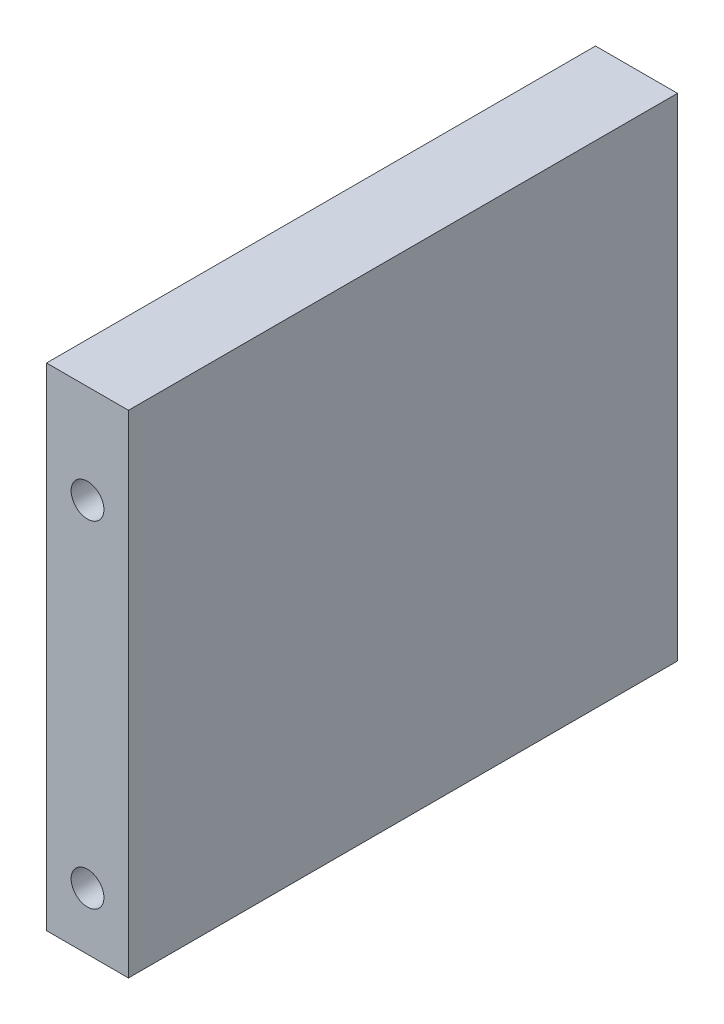
ISO-10303-21;
HEADER;
FILE_DESCRIPTION(('STEP AP214'),'2;1');
FILE_NAME('part.step','',(''),(''),'','','');
FILE_SCHEMA(('AUTOMOTIVE_DESIGN { 1 0 10303 214 1 1 1 1 }'));
ENDSEC;
DATA;
#1=APPLICATION_CONTEXT('core data for automotive mechanical design processes');
#2=APPLICATION_PROTOCOL_DEFINITION('international standard','automotive_design',2000,#1);
#3=PRODUCT_CONTEXT('',#1,'mechanical');
#4=PRODUCT('Part','Part','',(#3));
#5=PRODUCT_RELATED_PRODUCT_CATEGORY('part','',(#4));
#6=PRODUCT_DEFINITION_FORMATION('','',#4);
#7=PRODUCT_DEFINITION_CONTEXT('part definition',#1,'design');
#8=PRODUCT_DEFINITION('design','',#6,#7);
#9=PRODUCT_DEFINITION_SHAPE('','',#8);
#10=(LENGTH_UNIT() NAMED_UNIT(*) SI_UNIT(.MILLI.,.METRE.));
#11=(NAMED_UNIT(*) PLANE_ANGLE_UNIT() SI_UNIT($,.RADIAN.));
#12=(NAMED_UNIT(*) SI_UNIT($,.STERADIAN.) SOLID_ANGLE_UNIT());
#13=UNCERTAINTY_MEASURE_WITH_UNIT(LENGTH_MEASURE(1.E-05),#10,'distance_accuracy_value','');
#14=(GEOMETRIC_REPRESENTATION_CONTEXT(3) GLOBAL_UNCERTAINTY_ASSIGNED_CONTEXT((#13)) GLOBAL_UNIT_ASSIGNED_CONTEXT((#10,
#11,#12)) REPRESENTATION_CONTEXT('',''));
#15=CARTESIAN_POINT('',(0.,0.,0.));
#16=DIRECTION('',(0.,0.,1.));
#17=DIRECTION('',(1.,0.,0.));
#18=AXIS2_PLACEMENT_3D('',#15,#16,#17);
#19=CARTESIAN_POINT('',(5.,7.,10.0014));
#20=DIRECTION('',(0.,0.,1.));
#21=DIRECTION('',(1.,0.,0.));
#22=AXIS2_PLACEMENT_3D('',#19,#20,#21);
#23=PLANE('',#22);
#24=CARTESIAN_POINT('',(5.,7.,10.0014));
#25=DIRECTION('',(0.,0.,1.));
#26=DIRECTION('',(1.,0.,0.));
#27=AXIS2_PLACEMENT_3D('',#24,#25,#26);
#28=CIRCLE('',#27,2.);
#29=CARTESIAN_POINT('',(7.,7.,10.0014));
#30=VERTEX_POINT('',#29);
#31=EDGE_CURVE('E18',#30,#30,#28,.F.);
#32=ORIENTED_EDGE('',*,*,#31,.T.);
#33=EDGE_LOOP('',(#32));
#34=FACE_BOUND('',#33,.T.);
#35=ADVANCED_FACE('F15',(#34),#23,.F.);
#36=CARTESIAN_POINT('',(5.,48.,10.0014));
#37=DIRECTION('',(0.,0.,1.));
#38=DIRECTION('',(1.,0.,0.));
#39=AXIS2_PLACEMENT_3D('',#36,#37,#38);
#40=PLANE('',#39);
#41=CARTESIAN_POINT('',(5.,48.,10.0014));
#42=DIRECTION('',(0.,0.,1.));
#43=DIRECTION('',(1.,0.,0.));
#44=AXIS2_PLACEMENT_3D('',#41,#42,#43);
#45=CIRCLE('',#44,2.);
#46=CARTESIAN_POINT('',(7.,48.,10.0014));
#47=VERTEX_POINT('',#46);
#48=EDGE_CURVE('E95',#47,#47,#45,.F.);
#49=ORIENTED_EDGE('',*,*,#48,.T.);
#50=EDGE_LOOP('',(#49));
#51=FACE_BOUND('',#50,.T.);
#52=ADVANCED_FACE('F223',(#51),#40,.F.);
#53=CARTESIAN_POINT('',(5.,7.,57.0014));
#54=DIRECTION('',(0.,0.,1.));
#55=DIRECTION('',(1.,0.,0.));
#56=AXIS2_PLACEMENT_3D('',#53,#54,#55);
#57=PLANE('',#56);
#58=CARTESIAN_POINT('',(5.,7.,57.0014));
#59=DIRECTION('',(0.,0.,1.));
#60=DIRECTION('',(1.,0.,0.));
#61=AXIS2_PLACEMENT_3D('',#58,#59,#60);
#62=CIRCLE('',#61,2.);
#63=CARTESIAN_POINT('',(7.,7.,57.0014));
#64=VERTEX_POINT('',#63);
#65=EDGE_CURVE('E93',#64,#64,#62,.T.);
#66=ORIENTED_EDGE('',*,*,#65,.T.);
#67=EDGE_LOOP('',(#66));
#68=FACE_BOUND('',#67,.T.);
#69=ADVANCED_FACE('F116',(#68),#57,.T.);
#70=CARTESIAN_POINT('',(5.,48.,57.0014));
#71=DIRECTION('',(0.,0.,1.));
#72=DIRECTION('',(1.,0.,0.));
#73=AXIS2_PLACEMENT_3D('',#70,#71,#72);
#74=PLANE('',#73);
#75=CARTESIAN_POINT('',(5.,48.,57.0014));
#76=DIRECTION('',(0.,0.,1.));
#77=DIRECTION('',(1.,0.,0.));
#78=AXIS2_PLACEMENT_3D('',#75,#76,#77);
#79=CIRCLE('',#78,2.);
#80=CARTESIAN_POINT('',(7.,48.,57.0014));
#81=VERTEX_POINT('',#80);
#82=EDGE_CURVE('E64',#81,#81,#79,.T.);
#83=ORIENTED_EDGE('',*,*,#82,.T.);
#84=EDGE_LOOP('',(#83));
#85=FACE_BOUND('',#84,.T.);
#86=ADVANCED_FACE('F106',(#85),#74,.T.);
#87=CARTESIAN_POINT('',(5.,7.,0.001400000000103));
#88=DIRECTION('',(0.,0.,1.));
#89=DIRECTION('',(1.,0.,0.));
#90=AXIS2_PLACEMENT_3D('',#87,#88,#89);
#91=CYLINDRICAL_SURFACE('',#90,2.);
#92=CARTESIAN_POINT('',(5.,7.,0.001400000000103));
#93=DIRECTION('',(0.,0.,1.));
#94=DIRECTION('',(1.,0.,0.));
#95=AXIS2_PLACEMENT_3D('',#92,#93,#94);
#96=CIRCLE('',#95,2.);
#97=CARTESIAN_POINT('',(7.,7.,0.001400000000103));
#98=VERTEX_POINT('',#97);
#99=EDGE_CURVE('E72',#98,#98,#96,.F.);
#100=ORIENTED_EDGE('',*,*,#99,.T.);
#101=EDGE_LOOP('',(#100));
#102=FACE_BOUND('',#101,.T.);
#103=ORIENTED_EDGE('',*,*,#31,.F.);
#104=EDGE_LOOP('',(#103));
#105=FACE_BOUND('',#104,.T.);
#106=ADVANCED_FACE('F103',(#102,#105),#91,.F.);
#107=CARTESIAN_POINT('',(5.,48.,0.001400000000103));
#108=DIRECTION('',(0.,0.,1.));
#109=DIRECTION('',(1.,0.,0.));
#110=AXIS2_PLACEMENT_3D('',#107,#108,#109);
#111=CYLINDRICAL_SURFACE('',#110,2.);
#112=CARTESIAN_POINT('',(5.,48.,0.001400000000103));
#113=DIRECTION('',(0.,0.,1.));
#114=DIRECTION('',(1.,0.,0.));
#115=AXIS2_PLACEMENT_3D('',#112,#113,#114);
#116=CIRCLE('',#115,2.);
#117=CARTESIAN_POINT('',(7.,48.,0.001400000000103));
#118=VERTEX_POINT('',#117);
#119=EDGE_CURVE('E86',#118,#118,#116,.F.);
#120=ORIENTED_EDGE('',*,*,#119,.T.);
#121=EDGE_LOOP('',(#120));
#122=FACE_BOUND('',#121,.T.);
#123=ORIENTED_EDGE('',*,*,#48,.F.);
#124=EDGE_LOOP('',(#123));
#125=FACE_BOUND('',#124,.T.);
#126=ADVANCED_FACE('F105',(#122,#125),#111,.F.);
#127=CARTESIAN_POINT('',(10.,0.,0.001400000000103));
#128=DIRECTION('',(1.,0.,0.));
#129=DIRECTION('',(0.,0.,-1.));
#130=AXIS2_PLACEMENT_3D('',#127,#128,#129);
#131=PLANE('',#130);
#132=DIRECTION('',(0.,0.,1.));
#133=VECTOR('',#132,1.);
#134=CARTESIAN_POINT('',(10.,60.,0.001400000000103));
#135=LINE('',#134,#133);
#136=CARTESIAN_POINT('',(10.,60.,67.0014));
#137=VERTEX_POINT('',#136);
#138=CARTESIAN_POINT('',(10.,60.,0.001400000000103));
#139=VERTEX_POINT('',#138);
#140=EDGE_CURVE('E248',#137,#139,#135,.F.);
#141=ORIENTED_EDGE('',*,*,#140,.F.);
#142=DIRECTION('',(0.,1.,0.));
#143=VECTOR('',#142,1.);
#144=CARTESIAN_POINT('',(10.,0.,67.0014));
#145=LINE('',#144,#143);
#146=CARTESIAN_POINT('',(10.,0.,67.0014));
#147=VERTEX_POINT('',#146);
#148=EDGE_CURVE('E58',#147,#137,#145,.T.);
#149=ORIENTED_EDGE('',*,*,#148,.F.);
#150=DIRECTION('',(0.,0.,1.));
#151=VECTOR('',#150,1.);
#152=CARTESIAN_POINT('',(10.,0.,0.001400000000103));
#153=LINE('',#152,#151);
#154=CARTESIAN_POINT('',(10.,0.,0.001400000000103));
#155=VERTEX_POINT('',#154);
#156=EDGE_CURVE('E56',#147,#155,#153,.F.);
#157=ORIENTED_EDGE('',*,*,#156,.T.);
#158=DIRECTION('',(0.,1.,0.));
#159=VECTOR('',#158,1.);
#160=CARTESIAN_POINT('',(10.,0.,0.001400000000103));
#161=LINE('',#160,#159);
#162=EDGE_CURVE('E53',#155,#139,#161,.T.);
#163=ORIENTED_EDGE('',*,*,#162,.T.);
#164=EDGE_LOOP('',(#141,#149,#157,#163));
#165=FACE_BOUND('',#164,.T.);
#166=ADVANCED_FACE('F57',(#165),#131,.T.);
#167=CARTESIAN_POINT('',(5.,7.,57.0014));
#168=DIRECTION('',(0.,0.,1.));
#169=DIRECTION('',(1.,0.,0.));
#170=AXIS2_PLACEMENT_3D('',#167,#168,#169);
#171=CYLINDRICAL_SURFACE('',#170,2.);
#172=ORIENTED_EDGE('',*,*,#65,.F.);
#173=EDGE_LOOP('',(#172));
#174=FACE_BOUND('',#173,.T.);
#175=CARTESIAN_POINT('',(5.,7.,67.0014));
#176=DIRECTION('',(0.,0.,1.));
#177=DIRECTION('',(1.,0.,0.));
#178=AXIS2_PLACEMENT_3D('',#175,#176,#177);
#179=CIRCLE('',#178,2.);
#180=CARTESIAN_POINT('',(7.,7.,67.0014));
#181=VERTEX_POINT('',#180);
#182=EDGE_CURVE('E83',#181,#181,#179,.F.);
#183=ORIENTED_EDGE('',*,*,#182,.F.);
#184=EDGE_LOOP('',(#183));
#185=FACE_BOUND('',#184,.T.);
#186=ADVANCED_FACE('F143',(#174,#185),#171,.F.);
#187=CARTESIAN_POINT('',(5.,48.,57.0014));
#188=DIRECTION('',(0.,0.,1.));
#189=DIRECTION('',(1.,0.,0.));
#190=AXIS2_PLACEMENT_3D('',#187,#188,#189);
#191=CYLINDRICAL_SURFACE('',#190,2.);
#192=ORIENTED_EDGE('',*,*,#82,.F.);
#193=EDGE_LOOP('',(#192));
#194=FACE_BOUND('',#193,.T.);
#195=CARTESIAN_POINT('',(5.,48.,67.0014));
#196=DIRECTION('',(0.,0.,1.));
#197=DIRECTION('',(1.,0.,0.));
#198=AXIS2_PLACEMENT_3D('',#195,#196,#197);
#199=CIRCLE('',#198,2.);
#200=CARTESIAN_POINT('',(7.,48.,67.0014));
#201=VERTEX_POINT('',#200);
#202=EDGE_CURVE('E80',#201,#201,#199,.F.);
#203=ORIENTED_EDGE('',*,*,#202,.F.);
#204=EDGE_LOOP('',(#203));
#205=FACE_BOUND('',#204,.T.);
#206=ADVANCED_FACE('F140',(#194,#205),#191,.F.);
#207=CARTESIAN_POINT('',(0.,0.,0.001400000000103));
#208=DIRECTION('',(0.,1.,0.));
#209=DIRECTION('',(0.,0.,1.));
#210=AXIS2_PLACEMENT_3D('',#207,#208,#209);
#211=PLANE('',#210);
#212=DIRECTION('',(1.,0.,0.));
#213=VECTOR('',#212,1.);
#214=CARTESIAN_POINT('',(0.,0.,67.0014));
#215=LINE('',#214,#213);
#216=CARTESIAN_POINT('',(0.,0.,67.0014));
#217=VERTEX_POINT('',#216);
#218=EDGE_CURVE('E246',#217,#147,#215,.T.);
#219=ORIENTED_EDGE('',*,*,#218,.F.);
#220=DIRECTION('',(0.,0.,-1.));
#221=VECTOR('',#220,1.);
#222=CARTESIAN_POINT('',(0.,0.,0.001400000000103));
#223=LINE('',#222,#221);
#224=CARTESIAN_POINT('',(0.,0.,0.001400000000103));
#225=VERTEX_POINT('',#224);
#226=EDGE_CURVE('E76',#217,#225,#223,.T.);
#227=ORIENTED_EDGE('',*,*,#226,.T.);
#228=DIRECTION('',(1.,0.,0.));
#229=VECTOR('',#228,1.);
#230=CARTESIAN_POINT('',(0.,0.,0.001400000000103));
#231=LINE('',#230,#229);
#232=EDGE_CURVE('E63',#225,#155,#231,.T.);
#233=ORIENTED_EDGE('',*,*,#232,.T.);
#234=ORIENTED_EDGE('',*,*,#156,.F.);
#235=EDGE_LOOP('',(#219,#227,#233,#234));
#236=FACE_BOUND('',#235,.T.);
#237=ADVANCED_FACE('F75',(#236),#211,.F.);
#238=CARTESIAN_POINT('',(0.,0.,0.001400000000103));
#239=DIRECTION('',(0.,0.,1.));
#240=DIRECTION('',(1.,0.,0.));
#241=AXIS2_PLACEMENT_3D('',#238,#239,#240);
#242=PLANE('',#241);
#243=ORIENTED_EDGE('',*,*,#119,.F.);
#244=EDGE_LOOP('',(#243));
#245=FACE_BOUND('',#244,.T.);
#246=ORIENTED_EDGE('',*,*,#99,.F.);
#247=EDGE_LOOP('',(#246));
#248=FACE_BOUND('',#247,.T.);
#249=ORIENTED_EDGE('',*,*,#162,.F.);
#250=ORIENTED_EDGE('',*,*,#232,.F.);
#251=DIRECTION('',(0.,1.,0.));
#252=VECTOR('',#251,1.);
#253=CARTESIAN_POINT('',(0.,0.,0.001400000000103));
#254=LINE('',#253,#252);
#255=CARTESIAN_POINT('',(0.,60.,0.001400000000103));
#256=VERTEX_POINT('',#255);
#257=EDGE_CURVE('E255',#225,#256,#254,.T.);
#258=ORIENTED_EDGE('',*,*,#257,.T.);
#259=DIRECTION('',(1.,0.,0.));
#260=VECTOR('',#259,1.);
#261=CARTESIAN_POINT('',(0.,60.,0.001400000000103));
#262=LINE('',#261,#260);
#263=EDGE_CURVE('E71',#139,#256,#262,.F.);
#264=ORIENTED_EDGE('',*,*,#263,.F.);
#265=EDGE_LOOP('',(#249,#250,#258,#264));
#266=FACE_BOUND('',#265,.T.);
#267=ADVANCED_FACE('F68',(#245,#248,#266),#242,.F.);
#268=CARTESIAN_POINT('',(0.,60.,0.001400000000103));
#269=DIRECTION('',(0.,1.,0.));
#270=DIRECTION('',(0.,0.,1.));
#271=AXIS2_PLACEMENT_3D('',#268,#269,#270);
#272=PLANE('',#271);
#273=DIRECTION('',(1.,0.,0.));
#274=VECTOR('',#273,1.);
#275=CARTESIAN_POINT('',(0.,60.,67.0014));
#276=LINE('',#275,#274);
#277=CARTESIAN_POINT('',(0.,60.,67.0014));
#278=VERTEX_POINT('',#277);
#279=EDGE_CURVE('E32',#137,#278,#276,.F.);
#280=ORIENTED_EDGE('',*,*,#279,.F.);
#281=ORIENTED_EDGE('',*,*,#140,.T.);
#282=ORIENTED_EDGE('',*,*,#263,.T.);
#283=DIRECTION('',(0.,0.,-1.));
#284=VECTOR('',#283,1.);
#285=CARTESIAN_POINT('',(0.,60.,0.001400000000103));
#286=LINE('',#285,#284);
#287=EDGE_CURVE('E24',#256,#278,#286,.F.);
#288=ORIENTED_EDGE('',*,*,#287,.T.);
#289=EDGE_LOOP('',(#280,#281,#282,#288));
#290=FACE_BOUND('',#289,.T.);
#291=ADVANCED_FACE('F127',(#290),#272,.T.);
#292=CARTESIAN_POINT('',(0.,0.,67.0014));
#293=DIRECTION('',(0.,0.,1.));
#294=DIRECTION('',(1.,0.,0.));
#295=AXIS2_PLACEMENT_3D('',#292,#293,#294);
#296=PLANE('',#295);
#297=ORIENTED_EDGE('',*,*,#202,.T.);
#298=EDGE_LOOP('',(#297));
#299=FACE_BOUND('',#298,.T.);
#300=ORIENTED_EDGE('',*,*,#182,.T.);
#301=EDGE_LOOP('',(#300));
#302=FACE_BOUND('',#301,.T.);
#303=ORIENTED_EDGE('',*,*,#148,.T.);
#304=ORIENTED_EDGE('',*,*,#279,.T.);
#305=DIRECTION('',(0.,1.,0.));
#306=VECTOR('',#305,1.);
#307=CARTESIAN_POINT('',(0.,0.,67.0014));
#308=LINE('',#307,#306);
#309=EDGE_CURVE('E9',#278,#217,#308,.F.);
#310=ORIENTED_EDGE('',*,*,#309,.T.);
#311=ORIENTED_EDGE('',*,*,#218,.T.);
#312=EDGE_LOOP('',(#303,#304,#310,#311));
#313=FACE_BOUND('',#312,.T.);
#314=ADVANCED_FACE('F121',(#299,#302,#313),#296,.T.);
#315=CARTESIAN_POINT('',(0.,0.,0.001400000000103));
#316=DIRECTION('',(1.,0.,0.));
#317=DIRECTION('',(0.,0.,-1.));
#318=AXIS2_PLACEMENT_3D('',#315,#316,#317);
#319=PLANE('',#318);
#320=ORIENTED_EDGE('',*,*,#287,.F.);
#321=ORIENTED_EDGE('',*,*,#257,.F.);
#322=ORIENTED_EDGE('',*,*,#226,.F.);
#323=ORIENTED_EDGE('',*,*,#309,.F.);
#324=EDGE_LOOP('',(#320,#321,#322,#323));
#325=FACE_BOUND('',#324,.T.);
#326=ADVANCED_FACE('F119',(#325),#319,.F.);
#327=CLOSED_SHELL('',(#35,#52,#69,#86,#106,#126,#166,#186,#206,#237,#267,#291,#314,#326));
#328=MANIFOLD_SOLID_BREP('B1',#327);
#329=ADVANCED_BREP_SHAPE_REPRESENTATION('',(#18,#328),#14);
#330=SHAPE_DEFINITION_REPRESENTATION(#9,#329);
ENDSEC;
END-ISO-10303-21;
